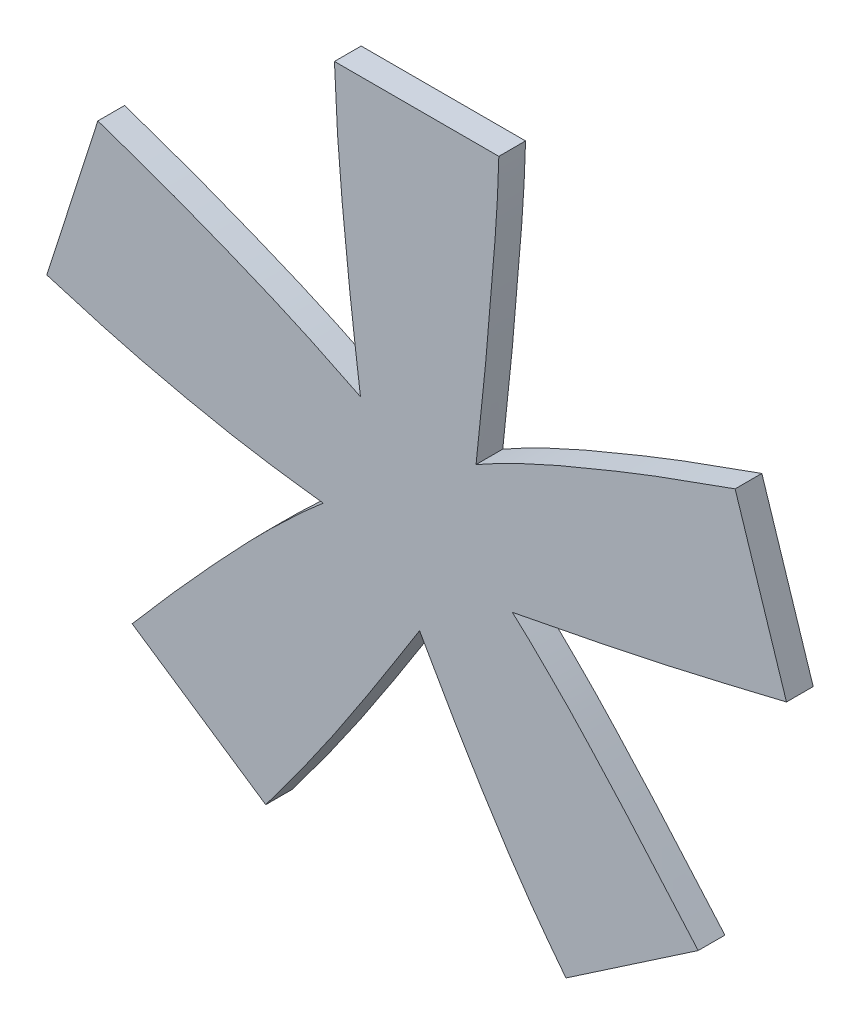
ISO-10303-21;
HEADER;
FILE_DESCRIPTION(('STEP AP214'),'2;1');
FILE_NAME('part.step','',(''),(''),'','','');
FILE_SCHEMA(('AUTOMOTIVE_DESIGN { 1 0 10303 214 1 1 1 1 }'));
ENDSEC;
DATA;
#1=APPLICATION_CONTEXT('core data for automotive mechanical design processes');
#2=APPLICATION_PROTOCOL_DEFINITION('international standard','automotive_design',2000,#1);
#3=PRODUCT_CONTEXT('',#1,'mechanical');
#4=PRODUCT('Part','Part','',(#3));
#5=PRODUCT_RELATED_PRODUCT_CATEGORY('part','',(#4));
#6=PRODUCT_DEFINITION_FORMATION('','',#4);
#7=PRODUCT_DEFINITION_CONTEXT('part definition',#1,'design');
#8=PRODUCT_DEFINITION('design','',#6,#7);
#9=PRODUCT_DEFINITION_SHAPE('','',#8);
#10=(LENGTH_UNIT() NAMED_UNIT(*) SI_UNIT(.MILLI.,.METRE.));
#11=(NAMED_UNIT(*) PLANE_ANGLE_UNIT() SI_UNIT($,.RADIAN.));
#12=(NAMED_UNIT(*) SI_UNIT($,.STERADIAN.) SOLID_ANGLE_UNIT());
#13=UNCERTAINTY_MEASURE_WITH_UNIT(LENGTH_MEASURE(1.E-05),#10,'distance_accuracy_value','');
#14=(GEOMETRIC_REPRESENTATION_CONTEXT(3) GLOBAL_UNCERTAINTY_ASSIGNED_CONTEXT((#13)) GLOBAL_UNIT_ASSIGNED_CONTEXT((#10,
#11,#12)) REPRESENTATION_CONTEXT('',''));
#15=CARTESIAN_POINT('',(0.,0.,0.));
#16=DIRECTION('',(0.,0.,1.));
#17=DIRECTION('',(1.,0.,0.));
#18=AXIS2_PLACEMENT_3D('',#15,#16,#17);
#19=CARTESIAN_POINT('',(1.7908653846154,7.734375,0.5));
#20=CARTESIAN_POINT('',(2.66976351652668,7.90377060045102,0.5));
#21=CARTESIAN_POINT('',(4.38901340842698,8.23513251509118,0.5));
#22=CARTESIAN_POINT('',(6.09110967813935,8.64554729842392,0.5));
#23=CARTESIAN_POINT('',(6.92307692307694,8.84615384615385,0.5));
#24=B_SPLINE_CURVE_WITH_KNOTS('',3,(#19,#20,#21,#22,#23),.UNSPECIFIED.,.F.,.F.,(4,1,4),(0.,
0.511210229561116,1.),.UNSPECIFIED.);
#25=DIRECTION('',(0.,0.,-1.));
#26=VECTOR('',#25,1.);
#27=SURFACE_OF_LINEAR_EXTRUSION('',#24,#26);
#28=CARTESIAN_POINT('',(1.7908653846154,7.734375,0.));
#29=CARTESIAN_POINT('',(2.66976351652668,7.90377060045102,0.));
#30=CARTESIAN_POINT('',(4.38901340842698,8.23513251509118,0.));
#31=CARTESIAN_POINT('',(6.09110967813935,8.64554729842392,0.));
#32=CARTESIAN_POINT('',(6.92307692307694,8.84615384615385,0.));
#33=B_SPLINE_CURVE_WITH_KNOTS('',3,(#28,#29,#30,#31,#32),.UNSPECIFIED.,.F.,.F.,(4,1,4),(0.,
0.511210229561116,1.),.UNSPECIFIED.);
#34=CARTESIAN_POINT('',(1.7908653846154,7.734375,0.));
#35=VERTEX_POINT('',#34);
#36=CARTESIAN_POINT('',(6.92307692307694,8.84615384615385,0.));
#37=VERTEX_POINT('',#36);
#38=EDGE_CURVE('E182',#35,#37,#33,.T.);
#39=ORIENTED_EDGE('',*,*,#38,.T.);
#40=DIRECTION('',(0.,0.,-1.));
#41=VECTOR('',#40,1.);
#42=CARTESIAN_POINT('',(6.92307692307694,8.84615384615385,0.5));
#43=LINE('',#42,#41);
#44=CARTESIAN_POINT('',(6.92307692307694,8.84615384615385,0.5));
#45=VERTEX_POINT('',#44);
#46=EDGE_CURVE('E11',#45,#37,#43,.T.);
#47=ORIENTED_EDGE('',*,*,#46,.F.);
#48=CARTESIAN_POINT('',(1.7908653846154,7.734375,0.5));
#49=VERTEX_POINT('',#48);
#50=EDGE_CURVE('E381',#49,#45,#24,.T.);
#51=ORIENTED_EDGE('',*,*,#50,.F.);
#52=DIRECTION('',(0.,0.,-1.));
#53=VECTOR('',#52,1.);
#54=CARTESIAN_POINT('',(1.7908653846154,7.734375,0.5));
#55=LINE('',#54,#53);
#56=EDGE_CURVE('E174',#49,#35,#55,.T.);
#57=ORIENTED_EDGE('',*,*,#56,.T.);
#58=EDGE_LOOP('',(#39,#47,#51,#57));
#59=FACE_BOUND('',#58,.T.);
#60=ADVANCED_FACE('F39',(#59),#27,.F.);
#61=CARTESIAN_POINT('',(6.92307692307694,8.84615384615385,0.5));
#62=DIRECTION('',(-0.951527276037781,-0.307564372052616,0.));
#63=DIRECTION('',(0.307564372052616,-0.951527276037781,0.));
#64=AXIS2_PLACEMENT_3D('',#61,#62,#63);
#65=PLANE('',#64);
#66=DIRECTION('',(-0.307564372052616,0.951527276037781,0.));
#67=VECTOR('',#66,1.);
#68=CARTESIAN_POINT('',(6.92307692307694,8.84615384615385,0.));
#69=LINE('',#68,#67);
#70=CARTESIAN_POINT('',(5.96153846153848,11.8209134615385,0.));
#71=VERTEX_POINT('',#70);
#72=EDGE_CURVE('E319',#37,#71,#69,.T.);
#73=ORIENTED_EDGE('',*,*,#72,.T.);
#74=DIRECTION('',(0.,0.,-1.));
#75=VECTOR('',#74,1.);
#76=CARTESIAN_POINT('',(5.96153846153848,11.8209134615385,0.5));
#77=LINE('',#76,#75);
#78=CARTESIAN_POINT('',(5.96153846153848,11.8209134615385,0.5));
#79=VERTEX_POINT('',#78);
#80=EDGE_CURVE('E48',#79,#71,#77,.T.);
#81=ORIENTED_EDGE('',*,*,#80,.F.);
#82=DIRECTION('',(-0.307564372052616,0.951527276037781,0.));
#83=VECTOR('',#82,1.);
#84=CARTESIAN_POINT('',(6.92307692307694,8.84615384615385,0.5));
#85=LINE('',#84,#83);
#86=EDGE_CURVE('E118',#45,#79,#85,.T.);
#87=ORIENTED_EDGE('',*,*,#86,.F.);
#88=ORIENTED_EDGE('',*,*,#46,.T.);
#89=EDGE_LOOP('',(#73,#81,#87,#88));
#90=FACE_BOUND('',#89,.T.);
#91=ADVANCED_FACE('F413',(#90),#65,.F.);
#92=CARTESIAN_POINT('',(5.96153846153848,11.8209134615385,0.5));
#93=CARTESIAN_POINT('',(5.69300433231756,11.7250590958885,0.5));
#94=CARTESIAN_POINT('',(5.17318389979396,11.539507047231,0.5));
#95=CARTESIAN_POINT('',(4.42208915792644,11.2659170413751,0.5));
#96=CARTESIAN_POINT('',(3.73191016808082,10.9946997755924,0.5));
#97=CARTESIAN_POINT('',(3.09930960211314,10.7351720393686,0.5));
#98=CARTESIAN_POINT('',(2.52045377820193,10.4908482864277,0.5));
#99=CARTESIAN_POINT('',(2.00037546509145,10.2504131365004,0.5));
#100=CARTESIAN_POINT('',(1.53334498956405,10.0238515405505,0.5));
#101=CARTESIAN_POINT('',(1.24736663907027,9.86498508130543,0.5));
#102=CARTESIAN_POINT('',(1.11177884615386,9.78966346153846,0.5));
#103=B_SPLINE_CURVE_WITH_KNOTS('',3,(#92,#93,#94,#95,#96,#97,#98,#99,#100,#101,#102),
.UNSPECIFIED.,.F.,.F.,(4,1,1,1,1,1,1,1,4),(0.,0.162502246319684,0.314567046702886,
0.45555258604994,0.585090351352676,0.704267536526922,0.813587791160144,0.911618414730943,1.),.UNSPECIFIED.);
#104=DIRECTION('',(0.,0.,-1.));
#105=VECTOR('',#104,1.);
#106=SURFACE_OF_LINEAR_EXTRUSION('',#103,#105);
#107=CARTESIAN_POINT('',(5.96153846153848,11.8209134615385,0.));
#108=CARTESIAN_POINT('',(5.69300433231756,11.7250590958885,0.));
#109=CARTESIAN_POINT('',(5.17318389979396,11.539507047231,0.));
#110=CARTESIAN_POINT('',(4.42208915792644,11.2659170413751,0.));
#111=CARTESIAN_POINT('',(3.73191016808082,10.9946997755924,0.));
#112=CARTESIAN_POINT('',(3.09930960211314,10.7351720393686,0.));
#113=CARTESIAN_POINT('',(2.52045377820193,10.4908482864277,0.));
#114=CARTESIAN_POINT('',(2.00037546509145,10.2504131365004,0.));
#115=CARTESIAN_POINT('',(1.53334498956405,10.0238515405505,0.));
#116=CARTESIAN_POINT('',(1.24736663907027,9.86498508130543,0.));
#117=CARTESIAN_POINT('',(1.11177884615386,9.78966346153846,0.));
#118=B_SPLINE_CURVE_WITH_KNOTS('',3,(#107,#108,#109,#110,#111,#112,#113,#114,#115,#116,#117),
.UNSPECIFIED.,.F.,.F.,(4,1,1,1,1,1,1,1,4),(0.,0.162502246319684,0.314567046702886,
0.45555258604994,0.585090351352676,0.704267536526922,0.813587791160144,0.911618414730943,1.),.UNSPECIFIED.);
#119=CARTESIAN_POINT('',(1.11177884615386,9.78966346153846,0.));
#120=VERTEX_POINT('',#119);
#121=EDGE_CURVE('E314',#71,#120,#118,.T.);
#122=ORIENTED_EDGE('',*,*,#121,.T.);
#123=DIRECTION('',(0.,0.,-1.));
#124=VECTOR('',#123,1.);
#125=CARTESIAN_POINT('',(1.11177884615386,9.78966346153846,0.5));
#126=LINE('',#125,#124);
#127=CARTESIAN_POINT('',(1.11177884615386,9.78966346153846,0.5));
#128=VERTEX_POINT('',#127);
#129=EDGE_CURVE('E310',#128,#120,#126,.T.);
#130=ORIENTED_EDGE('',*,*,#129,.F.);
#131=EDGE_CURVE('E316',#79,#128,#103,.T.);
#132=ORIENTED_EDGE('',*,*,#131,.F.);
#133=ORIENTED_EDGE('',*,*,#80,.T.);
#134=EDGE_LOOP('',(#122,#130,#132,#133));
#135=FACE_BOUND('',#134,.T.);
#136=ADVANCED_FACE('F313',(#135),#106,.F.);
#137=CARTESIAN_POINT('',(1.11177884615386,9.78966346153846,0.5));
#138=CARTESIAN_POINT('',(1.14392331768674,10.0921343743814,0.5));
#139=CARTESIAN_POINT('',(1.20564188134991,10.6728896147175,0.5));
#140=CARTESIAN_POINT('',(1.29286474016975,11.5077794821757,0.5));
#141=CARTESIAN_POINT('',(1.35499979046579,12.2717399040089,0.5));
#142=CARTESIAN_POINT('',(1.41734717118134,12.9604759394358,0.5));
#143=CARTESIAN_POINT('',(1.46567813012478,13.5754813754087,0.5));
#144=CARTESIAN_POINT('',(1.50201303520985,14.1163608856261,0.5));
#145=CARTESIAN_POINT('',(1.5273884884707,14.5831354172037,0.5));
#146=CARTESIAN_POINT('',(1.53500230052148,14.8697708597114,0.5));
#147=CARTESIAN_POINT('',(1.53846153846155,15.,0.5));
#148=B_SPLINE_CURVE_WITH_KNOTS('',3,(#137,#138,#139,#140,#141,#142,#143,#144,#145,#146,#147),
.UNSPECIFIED.,.F.,.F.,(4,1,1,1,1,1,1,1,4),(0.,0.174513923175893,0.335073129655383,
0.481579113991531,0.614245925312105,0.731833257983066,0.835498735372637,0.925260958374882,1.),.UNSPECIFIED.);
#149=DIRECTION('',(0.,0.,-1.));
#150=VECTOR('',#149,1.);
#151=SURFACE_OF_LINEAR_EXTRUSION('',#148,#150);
#152=CARTESIAN_POINT('',(1.11177884615386,9.78966346153846,0.));
#153=CARTESIAN_POINT('',(1.14392331768674,10.0921343743814,0.));
#154=CARTESIAN_POINT('',(1.20564188134991,10.6728896147175,0.));
#155=CARTESIAN_POINT('',(1.29286474016975,11.5077794821757,0.));
#156=CARTESIAN_POINT('',(1.35499979046579,12.2717399040089,0.));
#157=CARTESIAN_POINT('',(1.41734717118134,12.9604759394358,0.));
#158=CARTESIAN_POINT('',(1.46567813012478,13.5754813754087,0.));
#159=CARTESIAN_POINT('',(1.50201303520985,14.1163608856261,0.));
#160=CARTESIAN_POINT('',(1.5273884884707,14.5831354172037,0.));
#161=CARTESIAN_POINT('',(1.53500230052148,14.8697708597114,0.));
#162=CARTESIAN_POINT('',(1.53846153846155,15.,0.));
#163=B_SPLINE_CURVE_WITH_KNOTS('',3,(#152,#153,#154,#155,#156,#157,#158,#159,#160,#161,#162),
.UNSPECIFIED.,.F.,.F.,(4,1,1,1,1,1,1,1,4),(0.,0.174513923175893,0.335073129655383,
0.481579113991531,0.614245925312105,0.731833257983066,0.835498735372637,0.925260958374882,1.),.UNSPECIFIED.);
#164=CARTESIAN_POINT('',(1.53846153846155,15.,0.));
#165=VERTEX_POINT('',#164);
#166=EDGE_CURVE('E325',#120,#165,#163,.T.);
#167=ORIENTED_EDGE('',*,*,#166,.T.);
#168=DIRECTION('',(0.,0.,-1.));
#169=VECTOR('',#168,1.);
#170=CARTESIAN_POINT('',(1.53846153846155,15.,0.5));
#171=LINE('',#170,#169);
#172=CARTESIAN_POINT('',(1.53846153846155,15.,0.5));
#173=VERTEX_POINT('',#172);
#174=EDGE_CURVE('E305',#173,#165,#171,.T.);
#175=ORIENTED_EDGE('',*,*,#174,.F.);
#176=EDGE_CURVE('E403',#128,#173,#148,.T.);
#177=ORIENTED_EDGE('',*,*,#176,.F.);
#178=ORIENTED_EDGE('',*,*,#129,.T.);
#179=EDGE_LOOP('',(#167,#175,#177,#178));
#180=FACE_BOUND('',#179,.T.);
#181=ADVANCED_FACE('F412',(#180),#151,.F.);
#182=CARTESIAN_POINT('',(1.53846153846155,15.,0.5));
#183=DIRECTION('',(0.,-1.,0.));
#184=DIRECTION('',(0.,0.,-1.));
#185=AXIS2_PLACEMENT_3D('',#182,#183,#184);
#186=PLANE('',#185);
#187=DIRECTION('',(-1.,0.,0.));
#188=VECTOR('',#187,1.);
#189=CARTESIAN_POINT('',(1.53846153846155,15.,0.));
#190=LINE('',#189,#188);
#191=CARTESIAN_POINT('',(-1.53846153846153,15.,0.));
#192=VERTEX_POINT('',#191);
#193=EDGE_CURVE('E323',#165,#192,#190,.T.);
#194=ORIENTED_EDGE('',*,*,#193,.T.);
#195=DIRECTION('',(0.,0.,-1.));
#196=VECTOR('',#195,1.);
#197=CARTESIAN_POINT('',(-1.53846153846153,15.,0.5));
#198=LINE('',#197,#196);
#199=CARTESIAN_POINT('',(-1.53846153846153,15.,0.5));
#200=VERTEX_POINT('',#199);
#201=EDGE_CURVE('E303',#200,#192,#198,.T.);
#202=ORIENTED_EDGE('',*,*,#201,.F.);
#203=DIRECTION('',(-1.,0.,0.));
#204=VECTOR('',#203,1.);
#205=CARTESIAN_POINT('',(1.53846153846155,15.,0.5));
#206=LINE('',#205,#204);
#207=EDGE_CURVE('E676',#173,#200,#206,.T.);
#208=ORIENTED_EDGE('',*,*,#207,.F.);
#209=ORIENTED_EDGE('',*,*,#174,.T.);
#210=EDGE_LOOP('',(#194,#202,#208,#209));
#211=FACE_BOUND('',#210,.T.);
#212=ADVANCED_FACE('F431',(#211),#186,.F.);
#213=CARTESIAN_POINT('',(-1.53846153846153,15.,0.5));
#214=CARTESIAN_POINT('',(-1.52311412395573,14.6332462591926,0.5));
#215=CARTESIAN_POINT('',(-1.49053606214136,13.8547355833938,0.5));
#216=CARTESIAN_POINT('',(-1.38131718607948,12.6228932917373,0.5));
#217=CARTESIAN_POINT('',(-1.23835569905251,11.2583550898258,0.5));
#218=CARTESIAN_POINT('',(-1.11583800201776,10.3062524460624,0.5));
#219=CARTESIAN_POINT('',(-1.05168269230768,9.80769230769231,0.5));
#220=B_SPLINE_CURVE_WITH_KNOTS('',3,(#213,#214,#215,#216,#217,#218,#219),.UNSPECIFIED.,.F.,.F.,
(4,1,1,1,4),(0.,0.211056989542854,0.448012116248224,0.710956421028166,1.),.UNSPECIFIED.);
#221=DIRECTION('',(0.,0.,-1.));
#222=VECTOR('',#221,1.);
#223=SURFACE_OF_LINEAR_EXTRUSION('',#220,#222);
#224=CARTESIAN_POINT('',(-1.53846153846153,15.,0.));
#225=CARTESIAN_POINT('',(-1.52311412395573,14.6332462591926,0.));
#226=CARTESIAN_POINT('',(-1.49053606214136,13.8547355833938,0.));
#227=CARTESIAN_POINT('',(-1.38131718607948,12.6228932917373,0.));
#228=CARTESIAN_POINT('',(-1.23835569905251,11.2583550898258,0.));
#229=CARTESIAN_POINT('',(-1.11583800201776,10.3062524460624,0.));
#230=CARTESIAN_POINT('',(-1.05168269230768,9.80769230769231,0.));
#231=B_SPLINE_CURVE_WITH_KNOTS('',3,(#224,#225,#226,#227,#228,#229,#230),.UNSPECIFIED.,.F.,.F.,
(4,1,1,1,4),(0.,0.211056989542854,0.448012116248224,0.710956421028166,1.),.UNSPECIFIED.);
#232=CARTESIAN_POINT('',(-1.05168269230768,9.80769230769231,0.));
#233=VERTEX_POINT('',#232);
#234=EDGE_CURVE('E336',#192,#233,#231,.T.);
#235=ORIENTED_EDGE('',*,*,#234,.T.);
#236=DIRECTION('',(0.,0.,-1.));
#237=VECTOR('',#236,1.);
#238=CARTESIAN_POINT('',(-1.05168269230768,9.80769230769231,0.5));
#239=LINE('',#238,#237);
#240=CARTESIAN_POINT('',(-1.05168269230768,9.80769230769231,0.5));
#241=VERTEX_POINT('',#240);
#242=EDGE_CURVE('E300',#241,#233,#239,.T.);
#243=ORIENTED_EDGE('',*,*,#242,.F.);
#244=EDGE_CURVE('E253',#200,#241,#220,.T.);
#245=ORIENTED_EDGE('',*,*,#244,.F.);
#246=ORIENTED_EDGE('',*,*,#201,.T.);
#247=EDGE_LOOP('',(#235,#243,#245,#246));
#248=FACE_BOUND('',#247,.T.);
#249=ADVANCED_FACE('F247',(#248),#223,.F.);
#250=CARTESIAN_POINT('',(-1.05168269230768,9.80769230769231,0.5));
#251=CARTESIAN_POINT('',(-1.42054686374569,9.98974435004066,0.5));
#252=CARTESIAN_POINT('',(-2.17821601820291,10.36369017529,0.5));
#253=CARTESIAN_POINT('',(-3.37452876552019,10.8643863906546,0.5));
#254=CARTESIAN_POINT('',(-4.64050827421985,11.3642493195168,0.5));
#255=CARTESIAN_POINT('',(-5.51757261350278,11.666066818269,0.5));
#256=CARTESIAN_POINT('',(-5.96754807692306,11.8209134615385,0.5));
#257=B_SPLINE_CURVE_WITH_KNOTS('',3,(#250,#251,#252,#253,#254,#255,#256),.UNSPECIFIED.,.F.,.F.,
(4,1,1,1,4),(0.,0.232062772959365,0.476670868530447,0.731507418661131,1.),.UNSPECIFIED.);
#258=DIRECTION('',(0.,0.,-1.));
#259=VECTOR('',#258,1.);
#260=SURFACE_OF_LINEAR_EXTRUSION('',#257,#259);
#261=CARTESIAN_POINT('',(-1.05168269230768,9.80769230769231,0.));
#262=CARTESIAN_POINT('',(-1.42054686374569,9.98974435004066,0.));
#263=CARTESIAN_POINT('',(-2.17821601820291,10.36369017529,0.));
#264=CARTESIAN_POINT('',(-3.37452876552019,10.8643863906546,0.));
#265=CARTESIAN_POINT('',(-4.64050827421985,11.3642493195168,0.));
#266=CARTESIAN_POINT('',(-5.51757261350278,11.666066818269,0.));
#267=CARTESIAN_POINT('',(-5.96754807692306,11.8209134615385,0.));
#268=B_SPLINE_CURVE_WITH_KNOTS('',3,(#261,#262,#263,#264,#265,#266,#267),.UNSPECIFIED.,.F.,.F.,
(4,1,1,1,4),(0.,0.232062772959365,0.476670868530447,0.731507418661131,1.),.UNSPECIFIED.);
#269=CARTESIAN_POINT('',(-5.96754807692306,11.8209134615385,0.));
#270=VERTEX_POINT('',#269);
#271=EDGE_CURVE('E344',#233,#270,#268,.T.);
#272=ORIENTED_EDGE('',*,*,#271,.T.);
#273=DIRECTION('',(0.,0.,-1.));
#274=VECTOR('',#273,1.);
#275=CARTESIAN_POINT('',(-5.96754807692306,11.8209134615385,0.5));
#276=LINE('',#275,#274);
#277=CARTESIAN_POINT('',(-5.96754807692306,11.8209134615385,0.5));
#278=VERTEX_POINT('',#277);
#279=EDGE_CURVE('E293',#278,#270,#276,.T.);
#280=ORIENTED_EDGE('',*,*,#279,.F.);
#281=EDGE_CURVE('E248',#241,#278,#257,.T.);
#282=ORIENTED_EDGE('',*,*,#281,.F.);
#283=ORIENTED_EDGE('',*,*,#242,.T.);
#284=EDGE_LOOP('',(#272,#280,#282,#283));
#285=FACE_BOUND('',#284,.T.);
#286=ADVANCED_FACE('F242',(#285),#260,.F.);
#287=CARTESIAN_POINT('',(-5.96754807692306,11.8209134615385,0.5));
#288=DIRECTION('',(0.952088580077389,-0.305822392388494,0.));
#289=DIRECTION('',(0.305822392388494,0.952088580077389,0.));
#290=AXIS2_PLACEMENT_3D('',#287,#288,#289);
#291=PLANE('',#290);
#292=DIRECTION('',(-0.305822392388494,-0.952088580077389,0.));
#293=VECTOR('',#292,1.);
#294=CARTESIAN_POINT('',(-5.96754807692306,11.8209134615385,0.));
#295=LINE('',#294,#293);
#296=CARTESIAN_POINT('',(-6.92307692307691,8.84615384615385,0.));
#297=VERTEX_POINT('',#296);
#298=EDGE_CURVE('E350',#270,#297,#295,.T.);
#299=ORIENTED_EDGE('',*,*,#298,.T.);
#300=DIRECTION('',(0.,0.,-1.));
#301=VECTOR('',#300,1.);
#302=CARTESIAN_POINT('',(-6.92307692307691,8.84615384615385,0.5));
#303=LINE('',#302,#301);
#304=CARTESIAN_POINT('',(-6.92307692307691,8.84615384615385,0.5));
#305=VERTEX_POINT('',#304);
#306=EDGE_CURVE('E274',#305,#297,#303,.T.);
#307=ORIENTED_EDGE('',*,*,#306,.F.);
#308=DIRECTION('',(-0.305822392388494,-0.952088580077389,0.));
#309=VECTOR('',#308,1.);
#310=CARTESIAN_POINT('',(-5.96754807692306,11.8209134615385,0.5));
#311=LINE('',#310,#309);
#312=EDGE_CURVE('E251',#278,#305,#311,.T.);
#313=ORIENTED_EDGE('',*,*,#312,.F.);
#314=ORIENTED_EDGE('',*,*,#279,.T.);
#315=EDGE_LOOP('',(#299,#307,#313,#314));
#316=FACE_BOUND('',#315,.T.);
#317=ADVANCED_FACE('F240',(#316),#291,.F.);
#318=CARTESIAN_POINT('',(-6.92307692307691,8.84615384615385,0.5));
#319=CARTESIAN_POINT('',(-6.48757680547524,8.71552172598136,0.5));
#320=CARTESIAN_POINT('',(-5.62382574699582,8.45643194044518,0.5));
#321=CARTESIAN_POINT('',(-4.32090907784372,8.14949980019744,0.5));
#322=CARTESIAN_POINT('',(-3.03296684737048,7.89470543393691,0.5));
#323=CARTESIAN_POINT('',(-2.17425760693292,7.78749427266796,0.5));
#324=CARTESIAN_POINT('',(-1.74879807692306,7.734375,0.5));
#325=B_SPLINE_CURVE_WITH_KNOTS('',3,(#318,#319,#320,#321,#322,#323,#324),.UNSPECIFIED.,.F.,.F.,
(4,1,1,1,4),(0.,0.257299936133897,0.510316951017726,0.757379669319003,1.),.UNSPECIFIED.);
#326=DIRECTION('',(0.,0.,-1.));
#327=VECTOR('',#326,1.);
#328=SURFACE_OF_LINEAR_EXTRUSION('',#325,#327);
#329=CARTESIAN_POINT('',(-6.92307692307691,8.84615384615385,0.));
#330=CARTESIAN_POINT('',(-6.48757680547524,8.71552172598136,0.));
#331=CARTESIAN_POINT('',(-5.62382574699582,8.45643194044518,0.));
#332=CARTESIAN_POINT('',(-4.32090907784372,8.14949980019744,0.));
#333=CARTESIAN_POINT('',(-3.03296684737048,7.89470543393691,0.));
#334=CARTESIAN_POINT('',(-2.17425760693292,7.78749427266796,0.));
#335=CARTESIAN_POINT('',(-1.74879807692306,7.734375,0.));
#336=B_SPLINE_CURVE_WITH_KNOTS('',3,(#329,#330,#331,#332,#333,#334,#335),.UNSPECIFIED.,.F.,.F.,
(4,1,1,1,4),(0.,0.257299936133897,0.510316951017726,0.757379669319003,1.),.UNSPECIFIED.);
#337=CARTESIAN_POINT('',(-1.74879807692306,7.734375,0.));
#338=VERTEX_POINT('',#337);
#339=EDGE_CURVE('E273',#297,#338,#336,.T.);
#340=ORIENTED_EDGE('',*,*,#339,.T.);
#341=DIRECTION('',(0.,0.,-1.));
#342=VECTOR('',#341,1.);
#343=CARTESIAN_POINT('',(-1.74879807692306,7.734375,0.5));
#344=LINE('',#343,#342);
#345=CARTESIAN_POINT('',(-1.74879807692306,7.734375,0.5));
#346=VERTEX_POINT('',#345);
#347=EDGE_CURVE('E271',#346,#338,#344,.T.);
#348=ORIENTED_EDGE('',*,*,#347,.F.);
#349=EDGE_CURVE('E225',#305,#346,#325,.T.);
#350=ORIENTED_EDGE('',*,*,#349,.F.);
#351=ORIENTED_EDGE('',*,*,#306,.T.);
#352=EDGE_LOOP('',(#340,#348,#350,#351));
#353=FACE_BOUND('',#352,.T.);
#354=ADVANCED_FACE('F232',(#353),#328,.F.);
#355=CARTESIAN_POINT('',(-1.74879807692306,7.734375,0.5));
#356=CARTESIAN_POINT('',(-1.85972993776163,7.63906037549737,0.5));
#357=CARTESIAN_POINT('',(-2.0975291365246,7.4347390816348,0.5));
#358=CARTESIAN_POINT('',(-2.46055277628144,7.090063449721,0.5));
#359=CARTESIAN_POINT('',(-2.86328852750922,6.70345863500144,0.5));
#360=CARTESIAN_POINT('',(-3.29091884414386,6.25947087493465,0.5));
#361=CARTESIAN_POINT('',(-3.75390661674222,5.76684200283118,0.5));
#362=CARTESIAN_POINT('',(-4.25018084352899,5.22139954578557,0.5));
#363=CARTESIAN_POINT('',(-4.78107328423546,4.62613912903523,0.5));
#364=CARTESIAN_POINT('',(-5.13900304521139,4.20741218376728,0.5));
#365=CARTESIAN_POINT('',(-5.32451923076922,3.99038461538461,0.5));
#366=B_SPLINE_CURVE_WITH_KNOTS('',3,(#355,#356,#357,#358,#359,#360,#361,#362,#363,#364,#365),
.UNSPECIFIED.,.F.,.F.,(4,1,1,1,1,1,1,1,4),(0.,0.0846571290187472,0.181475342593672,
0.289730713867615,0.407825317869643,0.538273319388817,0.681107933696265,0.834717181426824,1.),.UNSPECIFIED.);
#367=DIRECTION('',(0.,0.,-1.));
#368=VECTOR('',#367,1.);
#369=SURFACE_OF_LINEAR_EXTRUSION('',#366,#368);
#370=CARTESIAN_POINT('',(-1.74879807692306,7.734375,0.));
#371=CARTESIAN_POINT('',(-1.85972993776163,7.63906037549737,0.));
#372=CARTESIAN_POINT('',(-2.0975291365246,7.4347390816348,0.));
#373=CARTESIAN_POINT('',(-2.46055277628144,7.090063449721,0.));
#374=CARTESIAN_POINT('',(-2.86328852750922,6.70345863500144,0.));
#375=CARTESIAN_POINT('',(-3.29091884414386,6.25947087493465,0.));
#376=CARTESIAN_POINT('',(-3.75390661674222,5.76684200283118,0.));
#377=CARTESIAN_POINT('',(-4.25018084352899,5.22139954578557,0.));
#378=CARTESIAN_POINT('',(-4.78107328423546,4.62613912903523,0.));
#379=CARTESIAN_POINT('',(-5.13900304521139,4.20741218376728,0.));
#380=CARTESIAN_POINT('',(-5.32451923076922,3.99038461538461,0.));
#381=B_SPLINE_CURVE_WITH_KNOTS('',3,(#370,#371,#372,#373,#374,#375,#376,#377,#378,#379,#380),
.UNSPECIFIED.,.F.,.F.,(4,1,1,1,1,1,1,1,4),(0.,0.0846571290187472,0.181475342593672,
0.289730713867615,0.407825317869643,0.538273319388817,0.681107933696265,0.834717181426824,1.),.UNSPECIFIED.);
#382=CARTESIAN_POINT('',(-5.32451923076922,3.99038461538461,0.));
#383=VERTEX_POINT('',#382);
#384=EDGE_CURVE('E279',#338,#383,#381,.T.);
#385=ORIENTED_EDGE('',*,*,#384,.T.);
#386=DIRECTION('',(0.,0.,-1.));
#387=VECTOR('',#386,1.);
#388=CARTESIAN_POINT('',(-5.32451923076922,3.99038461538461,0.5));
#389=LINE('',#388,#387);
#390=CARTESIAN_POINT('',(-5.32451923076922,3.99038461538461,0.5));
#391=VERTEX_POINT('',#390);
#392=EDGE_CURVE('E276',#391,#383,#389,.T.);
#393=ORIENTED_EDGE('',*,*,#392,.F.);
#394=EDGE_CURVE('E220',#346,#391,#366,.T.);
#395=ORIENTED_EDGE('',*,*,#394,.F.);
#396=ORIENTED_EDGE('',*,*,#347,.T.);
#397=EDGE_LOOP('',(#385,#393,#395,#396));
#398=FACE_BOUND('',#397,.T.);
#399=ADVANCED_FACE('F229',(#398),#369,.F.);
#400=CARTESIAN_POINT('',(-5.32451923076922,3.99038461538461,0.5));
#401=DIRECTION('',(0.558376368589991,0.829587747619415,0.));
#402=DIRECTION('',(-0.829587747619415,0.558376368589991,0.));
#403=AXIS2_PLACEMENT_3D('',#400,#401,#402);
#404=PLANE('',#403);
#405=DIRECTION('',(0.829587747619415,-0.558376368589991,0.));
#406=VECTOR('',#405,1.);
#407=CARTESIAN_POINT('',(-5.32451923076922,3.99038461538461,0.));
#408=LINE('',#407,#406);
#409=CARTESIAN_POINT('',(-2.82451923076922,2.30769230769231,0.));
#410=VERTEX_POINT('',#409);
#411=EDGE_CURVE('E289',#383,#410,#408,.T.);
#412=ORIENTED_EDGE('',*,*,#411,.T.);
#413=DIRECTION('',(0.,0.,-1.));
#414=VECTOR('',#413,1.);
#415=CARTESIAN_POINT('',(-2.82451923076922,2.30769230769231,0.5));
#416=LINE('',#415,#414);
#417=CARTESIAN_POINT('',(-2.82451923076922,2.30769230769231,0.5));
#418=VERTEX_POINT('',#417);
#419=EDGE_CURVE('E284',#418,#410,#416,.T.);
#420=ORIENTED_EDGE('',*,*,#419,.F.);
#421=DIRECTION('',(0.829587747619415,-0.558376368589991,0.));
#422=VECTOR('',#421,1.);
#423=CARTESIAN_POINT('',(-5.32451923076922,3.99038461538461,0.5));
#424=LINE('',#423,#422);
#425=EDGE_CURVE('E212',#391,#418,#424,.T.);
#426=ORIENTED_EDGE('',*,*,#425,.F.);
#427=ORIENTED_EDGE('',*,*,#392,.T.);
#428=EDGE_LOOP('',(#412,#420,#426,#427));
#429=FACE_BOUND('',#428,.T.);
#430=ADVANCED_FACE('F203',(#429),#404,.F.);
#431=CARTESIAN_POINT('',(-2.82451923076922,2.30769230769231,0.5));
#432=CARTESIAN_POINT('',(-2.61261324027392,2.59100413166685,0.5));
#433=CARTESIAN_POINT('',(-2.15938255143304,3.19695969166127,0.5));
#434=CARTESIAN_POINT('',(-1.46934879360262,4.19062377526202,0.5));
#435=CARTESIAN_POINT('',(-0.725725316519795,5.33047722095925,0.5));
#436=CARTESIAN_POINT('',(-0.215150667902703,6.14106755851628,0.5));
#437=CARTESIAN_POINT('',(0.0540865384615532,6.56850961538461,0.5));
#438=B_SPLINE_CURVE_WITH_KNOTS('',3,(#431,#432,#433,#434,#435,#436,#437),.UNSPECIFIED.,.F.,.F.,
(4,1,1,1,4),(0.,0.206325010189005,0.441293926021128,0.705382037779896,1.),.UNSPECIFIED.);
#439=DIRECTION('',(0.,0.,-1.));
#440=VECTOR('',#439,1.);
#441=SURFACE_OF_LINEAR_EXTRUSION('',#438,#440);
#442=CARTESIAN_POINT('',(-2.82451923076922,2.30769230769231,0.));
#443=CARTESIAN_POINT('',(-2.61261324027392,2.59100413166685,0.));
#444=CARTESIAN_POINT('',(-2.15938255143304,3.19695969166127,0.));
#445=CARTESIAN_POINT('',(-1.46934879360262,4.19062377526202,0.));
#446=CARTESIAN_POINT('',(-0.725725316519795,5.33047722095925,0.));
#447=CARTESIAN_POINT('',(-0.215150667902703,6.14106755851628,0.));
#448=CARTESIAN_POINT('',(0.0540865384615532,6.56850961538461,0.));
#449=B_SPLINE_CURVE_WITH_KNOTS('',3,(#442,#443,#444,#445,#446,#447,#448),.UNSPECIFIED.,.F.,.F.,
(4,1,1,1,4),(0.,0.206325010189005,0.441293926021128,0.705382037779896,1.),.UNSPECIFIED.);
#450=CARTESIAN_POINT('',(0.0540865384615532,6.56850961538461,0.));
#451=VERTEX_POINT('',#450);
#452=EDGE_CURVE('E288',#410,#451,#449,.T.);
#453=ORIENTED_EDGE('',*,*,#452,.T.);
#454=DIRECTION('',(0.,0.,-1.));
#455=VECTOR('',#454,1.);
#456=CARTESIAN_POINT('',(0.0540865384615532,6.56850961538461,0.5));
#457=LINE('',#456,#455);
#458=CARTESIAN_POINT('',(0.0540865384615532,6.56850961538461,0.5));
#459=VERTEX_POINT('',#458);
#460=EDGE_CURVE('E170',#459,#451,#457,.T.);
#461=ORIENTED_EDGE('',*,*,#460,.F.);
#462=EDGE_CURVE('E158',#418,#459,#438,.T.);
#463=ORIENTED_EDGE('',*,*,#462,.F.);
#464=ORIENTED_EDGE('',*,*,#419,.T.);
#465=EDGE_LOOP('',(#453,#461,#463,#464));
#466=FACE_BOUND('',#465,.T.);
#467=ADVANCED_FACE('F205',(#466),#441,.F.);
#468=CARTESIAN_POINT('',(0.0540865384615532,6.56850961538461,0.5));
#469=CARTESIAN_POINT('',(0.303563724287472,6.12807941794429,0.5));
#470=CARTESIAN_POINT('',(0.774723410534996,5.29628811425083,0.5));
#471=CARTESIAN_POINT('',(1.48427206029028,4.1478255322131,0.5));
#472=CARTESIAN_POINT('',(2.14044675898105,3.16118044738705,0.5));
#473=CARTESIAN_POINT('',(2.58728710852658,2.57806314829484,0.5));
#474=CARTESIAN_POINT('',(2.79447115384617,2.30769230769231,0.5));
#475=B_SPLINE_CURVE_WITH_KNOTS('',3,(#468,#469,#470,#471,#472,#473,#474),.UNSPECIFIED.,.F.,.F.,
(4,1,1,1,4),(0.,0.299425723407892,0.565491908321195,0.798533985908683,1.),.UNSPECIFIED.);
#476=DIRECTION('',(0.,0.,-1.));
#477=VECTOR('',#476,1.);
#478=SURFACE_OF_LINEAR_EXTRUSION('',#475,#477);
#479=CARTESIAN_POINT('',(0.0540865384615532,6.56850961538461,0.));
#480=CARTESIAN_POINT('',(0.303563724287472,6.12807941794429,0.));
#481=CARTESIAN_POINT('',(0.774723410534996,5.29628811425083,0.));
#482=CARTESIAN_POINT('',(1.48427206029028,4.1478255322131,0.));
#483=CARTESIAN_POINT('',(2.14044675898105,3.16118044738705,0.));
#484=CARTESIAN_POINT('',(2.58728710852658,2.57806314829484,0.));
#485=CARTESIAN_POINT('',(2.79447115384617,2.30769230769231,0.));
#486=B_SPLINE_CURVE_WITH_KNOTS('',3,(#479,#480,#481,#482,#483,#484,#485),.UNSPECIFIED.,.F.,.F.,
(4,1,1,1,4),(0.,0.299425723407892,0.565491908321195,0.798533985908683,1.),.UNSPECIFIED.);
#487=CARTESIAN_POINT('',(2.79447115384617,2.30769230769231,0.));
#488=VERTEX_POINT('',#487);
#489=EDGE_CURVE('E166',#451,#488,#486,.T.);
#490=ORIENTED_EDGE('',*,*,#489,.T.);
#491=DIRECTION('',(0.,0.,-1.));
#492=VECTOR('',#491,1.);
#493=CARTESIAN_POINT('',(2.79447115384617,2.30769230769231,0.5));
#494=LINE('',#493,#492);
#495=CARTESIAN_POINT('',(2.79447115384617,2.30769230769231,0.5));
#496=VERTEX_POINT('',#495);
#497=EDGE_CURVE('E163',#496,#488,#494,.T.);
#498=ORIENTED_EDGE('',*,*,#497,.F.);
#499=EDGE_CURVE('E151',#459,#496,#475,.T.);
#500=ORIENTED_EDGE('',*,*,#499,.F.);
#501=ORIENTED_EDGE('',*,*,#460,.T.);
#502=EDGE_LOOP('',(#490,#498,#500,#501));
#503=FACE_BOUND('',#502,.T.);
#504=ADVANCED_FACE('F168',(#503),#478,.F.);
#505=CARTESIAN_POINT('',(2.79447115384617,2.30769230769231,0.5));
#506=DIRECTION('',(-0.56209036638766,0.827075824827558,0.));
#507=DIRECTION('',(-0.827075824827558,-0.56209036638766,0.));
#508=AXIS2_PLACEMENT_3D('',#505,#506,#507);
#509=PLANE('',#508);
#510=DIRECTION('',(0.827075824827558,0.56209036638766,0.));
#511=VECTOR('',#510,1.);
#512=CARTESIAN_POINT('',(2.79447115384617,2.30769230769231,0.));
#513=LINE('',#512,#511);
#514=CARTESIAN_POINT('',(5.27043269230771,3.99038461538461,0.));
#515=VERTEX_POINT('',#514);
#516=EDGE_CURVE('E107',#488,#515,#513,.T.);
#517=ORIENTED_EDGE('',*,*,#516,.T.);
#518=DIRECTION('',(0.,0.,-1.));
#519=VECTOR('',#518,1.);
#520=CARTESIAN_POINT('',(5.27043269230771,3.99038461538461,0.5));
#521=LINE('',#520,#519);
#522=CARTESIAN_POINT('',(5.27043269230771,3.99038461538461,0.5));
#523=VERTEX_POINT('',#522);
#524=EDGE_CURVE('E169',#523,#515,#521,.T.);
#525=ORIENTED_EDGE('',*,*,#524,.F.);
#526=DIRECTION('',(0.827075824827558,0.56209036638766,0.));
#527=VECTOR('',#526,1.);
#528=CARTESIAN_POINT('',(2.79447115384617,2.30769230769231,0.5));
#529=LINE('',#528,#527);
#530=EDGE_CURVE('E156',#496,#523,#529,.T.);
#531=ORIENTED_EDGE('',*,*,#530,.F.);
#532=ORIENTED_EDGE('',*,*,#497,.T.);
#533=EDGE_LOOP('',(#517,#525,#531,#532));
#534=FACE_BOUND('',#533,.T.);
#535=ADVANCED_FACE('F175',(#534),#509,.F.);
#536=CARTESIAN_POINT('',(5.27043269230771,3.99038461538461,0.5));
#537=CARTESIAN_POINT('',(5.07422028506213,4.21683494242334,0.5));
#538=CARTESIAN_POINT('',(4.69858011501507,4.65036430251918,0.5));
#539=CARTESIAN_POINT('',(4.15781838940517,5.27121839864656,0.5));
#540=CARTESIAN_POINT('',(3.65933311288661,5.8304870368411,0.5));
#541=CARTESIAN_POINT('',(3.20226346525684,6.3290022596409,0.5));
#542=CARTESIAN_POINT('',(2.79119127318926,6.76939849696258,0.5));
#543=CARTESIAN_POINT('',(2.41429053236681,7.13982775633941,0.5));
#544=CARTESIAN_POINT('',(2.09334739272633,7.46226803374612,0.5));
#545=CARTESIAN_POINT('',(1.88575371439607,7.6490152931177,0.5));
#546=CARTESIAN_POINT('',(1.7908653846154,7.734375,0.5));
#547=B_SPLINE_CURVE_WITH_KNOTS('',3,(#536,#537,#538,#539,#540,#541,#542,#543,#544,#545,#546),
.UNSPECIFIED.,.F.,.F.,(4,1,1,1,1,1,1,1,4),(0.,0.17575603516212,0.33647733016427,
0.482946322624207,0.615182635882755,0.733212992330237,0.836240886429301,0.925147871081278,1.),.UNSPECIFIED.);
#548=DIRECTION('',(0.,0.,-1.));
#549=VECTOR('',#548,1.);
#550=SURFACE_OF_LINEAR_EXTRUSION('',#547,#549);
#551=CARTESIAN_POINT('',(5.27043269230771,3.99038461538461,0.));
#552=CARTESIAN_POINT('',(5.07422028506213,4.21683494242334,0.));
#553=CARTESIAN_POINT('',(4.69858011501507,4.65036430251918,0.));
#554=CARTESIAN_POINT('',(4.15781838940517,5.27121839864656,0.));
#555=CARTESIAN_POINT('',(3.65933311288661,5.8304870368411,0.));
#556=CARTESIAN_POINT('',(3.20226346525684,6.3290022596409,0.));
#557=CARTESIAN_POINT('',(2.79119127318926,6.76939849696258,0.));
#558=CARTESIAN_POINT('',(2.41429053236681,7.13982775633941,0.));
#559=CARTESIAN_POINT('',(2.09334739272633,7.46226803374612,0.));
#560=CARTESIAN_POINT('',(1.88575371439607,7.6490152931177,0.));
#561=CARTESIAN_POINT('',(1.7908653846154,7.734375,0.));
#562=B_SPLINE_CURVE_WITH_KNOTS('',3,(#551,#552,#553,#554,#555,#556,#557,#558,#559,#560,#561),
.UNSPECIFIED.,.F.,.F.,(4,1,1,1,1,1,1,1,4),(0.,0.17575603516212,0.33647733016427,
0.482946322624207,0.615182635882755,0.733212992330237,0.836240886429301,0.925147871081278,1.),.UNSPECIFIED.);
#563=EDGE_CURVE('E115',#515,#35,#562,.T.);
#564=ORIENTED_EDGE('',*,*,#563,.T.);
#565=ORIENTED_EDGE('',*,*,#56,.F.);
#566=EDGE_CURVE('E57',#523,#49,#547,.T.);
#567=ORIENTED_EDGE('',*,*,#566,.F.);
#568=ORIENTED_EDGE('',*,*,#524,.T.);
#569=EDGE_LOOP('',(#564,#565,#567,#568));
#570=FACE_BOUND('',#569,.T.);
#571=ADVANCED_FACE('F195',(#570),#550,.F.);
#572=CARTESIAN_POINT('',(4.3655458565289,8.25074770539308,0.5));
#573=DIRECTION('',(0.,0.,-1.));
#574=DIRECTION('',(-1.,0.,0.));
#575=AXIS2_PLACEMENT_3D('',#572,#573,#574);
#576=PLANE('',#575);
#577=ORIENTED_EDGE('',*,*,#50,.T.);
#578=ORIENTED_EDGE('',*,*,#86,.T.);
#579=ORIENTED_EDGE('',*,*,#131,.T.);
#580=ORIENTED_EDGE('',*,*,#176,.T.);
#581=ORIENTED_EDGE('',*,*,#207,.T.);
#582=ORIENTED_EDGE('',*,*,#244,.T.);
#583=ORIENTED_EDGE('',*,*,#281,.T.);
#584=ORIENTED_EDGE('',*,*,#312,.T.);
#585=ORIENTED_EDGE('',*,*,#349,.T.);
#586=ORIENTED_EDGE('',*,*,#394,.T.);
#587=ORIENTED_EDGE('',*,*,#425,.T.);
#588=ORIENTED_EDGE('',*,*,#462,.T.);
#589=ORIENTED_EDGE('',*,*,#499,.T.);
#590=ORIENTED_EDGE('',*,*,#530,.T.);
#591=ORIENTED_EDGE('',*,*,#566,.T.);
#592=EDGE_LOOP('',(#577,#578,#579,#580,#581,#582,#583,#584,#585,#586,#587,#588,#589,#590,#591));
#593=FACE_BOUND('',#592,.T.);
#594=ADVANCED_FACE('F157',(#593),#576,.F.);
#595=CARTESIAN_POINT('',(4.3655458565289,8.25074770539308,0.));
#596=DIRECTION('',(0.,0.,-1.));
#597=DIRECTION('',(-1.,0.,0.));
#598=AXIS2_PLACEMENT_3D('',#595,#596,#597);
#599=PLANE('',#598);
#600=ORIENTED_EDGE('',*,*,#38,.F.);
#601=ORIENTED_EDGE('',*,*,#563,.F.);
#602=ORIENTED_EDGE('',*,*,#516,.F.);
#603=ORIENTED_EDGE('',*,*,#489,.F.);
#604=ORIENTED_EDGE('',*,*,#452,.F.);
#605=ORIENTED_EDGE('',*,*,#411,.F.);
#606=ORIENTED_EDGE('',*,*,#384,.F.);
#607=ORIENTED_EDGE('',*,*,#339,.F.);
#608=ORIENTED_EDGE('',*,*,#298,.F.);
#609=ORIENTED_EDGE('',*,*,#271,.F.);
#610=ORIENTED_EDGE('',*,*,#234,.F.);
#611=ORIENTED_EDGE('',*,*,#193,.F.);
#612=ORIENTED_EDGE('',*,*,#166,.F.);
#613=ORIENTED_EDGE('',*,*,#121,.F.);
#614=ORIENTED_EDGE('',*,*,#72,.F.);
#615=EDGE_LOOP('',(#600,#601,#602,#603,#604,#605,#606,#607,#608,#609,#610,#611,#612,#613,#614));
#616=FACE_BOUND('',#615,.T.);
#617=ADVANCED_FACE('F197',(#616),#599,.T.);
#618=CLOSED_SHELL('',(#60,#91,#136,#181,#212,#249,#286,#317,#354,#399,#430,#467,#504,#535,#571,
#594,#617));
#619=MANIFOLD_SOLID_BREP('B2',#618);
#620=ADVANCED_BREP_SHAPE_REPRESENTATION('',(#18,#619),#14);
#621=SHAPE_DEFINITION_REPRESENTATION(#9,#620);
ENDSEC;
END-ISO-10303-21;
